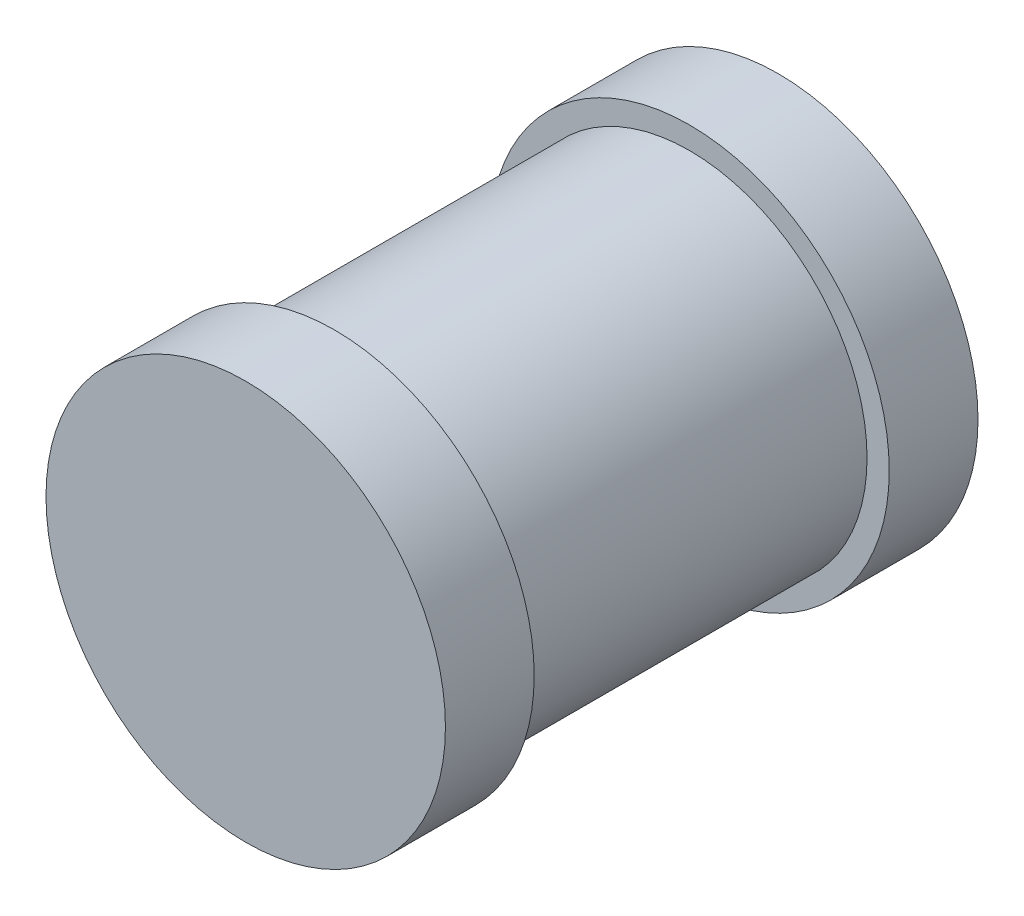
ISO-10303-21;
HEADER;
FILE_DESCRIPTION(('STEP AP214'),'2;1');
FILE_NAME('part.step','',(''),(''),'','','');
FILE_SCHEMA(('AUTOMOTIVE_DESIGN { 1 0 10303 214 1 1 1 1 }'));
ENDSEC;
DATA;
#1=APPLICATION_CONTEXT('core data for automotive mechanical design processes');
#2=APPLICATION_PROTOCOL_DEFINITION('international standard','automotive_design',2000,#1);
#3=PRODUCT_CONTEXT('',#1,'mechanical');
#4=PRODUCT('Part','Part','',(#3));
#5=PRODUCT_RELATED_PRODUCT_CATEGORY('part','',(#4));
#6=PRODUCT_DEFINITION_FORMATION('','',#4);
#7=PRODUCT_DEFINITION_CONTEXT('part definition',#1,'design');
#8=PRODUCT_DEFINITION('design','',#6,#7);
#9=PRODUCT_DEFINITION_SHAPE('','',#8);
#10=(LENGTH_UNIT() NAMED_UNIT(*) SI_UNIT(.MILLI.,.METRE.));
#11=(NAMED_UNIT(*) PLANE_ANGLE_UNIT() SI_UNIT($,.RADIAN.));
#12=(NAMED_UNIT(*) SI_UNIT($,.STERADIAN.) SOLID_ANGLE_UNIT());
#13=UNCERTAINTY_MEASURE_WITH_UNIT(LENGTH_MEASURE(1.E-05),#10,'distance_accuracy_value','');
#14=(GEOMETRIC_REPRESENTATION_CONTEXT(3) GLOBAL_UNCERTAINTY_ASSIGNED_CONTEXT((#13)) GLOBAL_UNIT_ASSIGNED_CONTEXT((#10,
#11,#12)) REPRESENTATION_CONTEXT('',''));
#15=CARTESIAN_POINT('',(0.,0.,0.));
#16=DIRECTION('',(0.,0.,1.));
#17=DIRECTION('',(1.,0.,0.));
#18=AXIS2_PLACEMENT_3D('',#15,#16,#17);
#19=CARTESIAN_POINT('',(0.,0.,8.));
#20=DIRECTION('',(0.,0.,-1.));
#21=DIRECTION('',(-1.,0.,0.));
#22=AXIS2_PLACEMENT_3D('',#19,#20,#21);
#23=CYLINDRICAL_SURFACE('',#22,4.);
#24=CARTESIAN_POINT('',(0.,0.,8.));
#25=DIRECTION('',(0.,0.,1.));
#26=DIRECTION('',(1.,0.,0.));
#27=AXIS2_PLACEMENT_3D('',#24,#25,#26);
#28=CIRCLE('',#27,4.);
#29=CARTESIAN_POINT('',(4.,0.,8.));
#30=VERTEX_POINT('',#29);
#31=EDGE_CURVE('E10',#30,#30,#28,.T.);
#32=ORIENTED_EDGE('',*,*,#31,.F.);
#33=EDGE_LOOP('',(#32));
#34=FACE_BOUND('',#33,.T.);
#35=CARTESIAN_POINT('',(0.,0.,0.));
#36=DIRECTION('',(0.,0.,1.));
#37=DIRECTION('',(1.,0.,0.));
#38=AXIS2_PLACEMENT_3D('',#35,#36,#37);
#39=CIRCLE('',#38,4.);
#40=CARTESIAN_POINT('',(4.,0.,0.));
#41=VERTEX_POINT('',#40);
#42=EDGE_CURVE('E40',#41,#41,#39,.T.);
#43=ORIENTED_EDGE('',*,*,#42,.T.);
#44=EDGE_LOOP('',(#43));
#45=FACE_BOUND('',#44,.T.);
#46=ADVANCED_FACE('F37',(#34,#45),#23,.T.);
#47=CARTESIAN_POINT('',(0.,0.,10.));
#48=DIRECTION('',(0.,0.,-1.));
#49=DIRECTION('',(-1.,0.,0.));
#50=AXIS2_PLACEMENT_3D('',#47,#48,#49);
#51=CYLINDRICAL_SURFACE('',#50,4.5);
#52=CARTESIAN_POINT('',(0.,0.,10.));
#53=DIRECTION('',(0.,0.,1.));
#54=DIRECTION('',(1.,0.,0.));
#55=AXIS2_PLACEMENT_3D('',#52,#53,#54);
#56=CIRCLE('',#55,4.5);
#57=CARTESIAN_POINT('',(4.5,0.,10.));
#58=VERTEX_POINT('',#57);
#59=EDGE_CURVE('E45',#58,#58,#56,.T.);
#60=ORIENTED_EDGE('',*,*,#59,.F.);
#61=EDGE_LOOP('',(#60));
#62=FACE_BOUND('',#61,.T.);
#63=CARTESIAN_POINT('',(0.,0.,8.));
#64=DIRECTION('',(0.,0.,1.));
#65=DIRECTION('',(1.,0.,0.));
#66=AXIS2_PLACEMENT_3D('',#63,#64,#65);
#67=CIRCLE('',#66,4.5);
#68=CARTESIAN_POINT('',(4.5,0.,8.));
#69=VERTEX_POINT('',#68);
#70=EDGE_CURVE('E50',#69,#69,#67,.T.);
#71=ORIENTED_EDGE('',*,*,#70,.T.);
#72=EDGE_LOOP('',(#71));
#73=FACE_BOUND('',#72,.T.);
#74=ADVANCED_FACE('F91',(#62,#73),#51,.T.);
#75=CARTESIAN_POINT('',(0.,0.,10.));
#76=DIRECTION('',(0.,0.,1.));
#77=DIRECTION('',(1.,0.,0.));
#78=AXIS2_PLACEMENT_3D('',#75,#76,#77);
#79=PLANE('',#78);
#80=ORIENTED_EDGE('',*,*,#59,.T.);
#81=EDGE_LOOP('',(#80));
#82=FACE_BOUND('',#81,.T.);
#83=ADVANCED_FACE('F87',(#82),#79,.T.);
#84=CARTESIAN_POINT('',(0.,0.,8.));
#85=DIRECTION('',(0.,0.,1.));
#86=DIRECTION('',(1.,0.,0.));
#87=AXIS2_PLACEMENT_3D('',#84,#85,#86);
#88=PLANE('',#87);
#89=ORIENTED_EDGE('',*,*,#31,.T.);
#90=EDGE_LOOP('',(#89));
#91=FACE_BOUND('',#90,.T.);
#92=ORIENTED_EDGE('',*,*,#70,.F.);
#93=EDGE_LOOP('',(#92));
#94=FACE_BOUND('',#93,.T.);
#95=ADVANCED_FACE('F79',(#91,#94),#88,.F.);
#96=CARTESIAN_POINT('',(0.,0.,-2.));
#97=DIRECTION('',(0.,0.,1.));
#98=DIRECTION('',(1.,0.,0.));
#99=AXIS2_PLACEMENT_3D('',#96,#97,#98);
#100=CYLINDRICAL_SURFACE('',#99,4.5);
#101=CARTESIAN_POINT('',(0.,0.,-2.));
#102=DIRECTION('',(0.,0.,-1.));
#103=DIRECTION('',(-1.,0.,0.));
#104=AXIS2_PLACEMENT_3D('',#101,#102,#103);
#105=CIRCLE('',#104,4.5);
#106=CARTESIAN_POINT('',(-4.5,0.,-2.));
#107=VERTEX_POINT('',#106);
#108=EDGE_CURVE('E60',#107,#107,#105,.T.);
#109=ORIENTED_EDGE('',*,*,#108,.F.);
#110=EDGE_LOOP('',(#109));
#111=FACE_BOUND('',#110,.T.);
#112=CARTESIAN_POINT('',(0.,0.,0.));
#113=DIRECTION('',(0.,0.,-1.));
#114=DIRECTION('',(-1.,0.,0.));
#115=AXIS2_PLACEMENT_3D('',#112,#113,#114);
#116=CIRCLE('',#115,4.5);
#117=CARTESIAN_POINT('',(-4.5,0.,0.));
#118=VERTEX_POINT('',#117);
#119=EDGE_CURVE('E56',#118,#118,#116,.T.);
#120=ORIENTED_EDGE('',*,*,#119,.T.);
#121=EDGE_LOOP('',(#120));
#122=FACE_BOUND('',#121,.T.);
#123=ADVANCED_FACE('F77',(#111,#122),#100,.T.);
#124=CARTESIAN_POINT('',(0.,0.,-2.));
#125=DIRECTION('',(0.,0.,-1.));
#126=DIRECTION('',(-1.,0.,0.));
#127=AXIS2_PLACEMENT_3D('',#124,#125,#126);
#128=PLANE('',#127);
#129=ORIENTED_EDGE('',*,*,#108,.T.);
#130=EDGE_LOOP('',(#129));
#131=FACE_BOUND('',#130,.T.);
#132=ADVANCED_FACE('F73',(#131),#128,.T.);
#133=CARTESIAN_POINT('',(0.,0.,0.));
#134=DIRECTION('',(0.,0.,-1.));
#135=DIRECTION('',(-1.,0.,0.));
#136=AXIS2_PLACEMENT_3D('',#133,#134,#135);
#137=PLANE('',#136);
#138=ORIENTED_EDGE('',*,*,#42,.F.);
#139=EDGE_LOOP('',(#138));
#140=FACE_BOUND('',#139,.T.);
#141=ORIENTED_EDGE('',*,*,#119,.F.);
#142=EDGE_LOOP('',(#141));
#143=FACE_BOUND('',#142,.T.);
#144=ADVANCED_FACE('F70',(#140,#143),#137,.F.);
#145=CLOSED_SHELL('',(#46,#74,#83,#95,#123,#132,#144));
#146=MANIFOLD_SOLID_BREP('B2',#145);
#147=ADVANCED_BREP_SHAPE_REPRESENTATION('',(#18,#146),#14);
#148=SHAPE_DEFINITION_REPRESENTATION(#9,#147);
ENDSEC;
END-ISO-10303-21;
